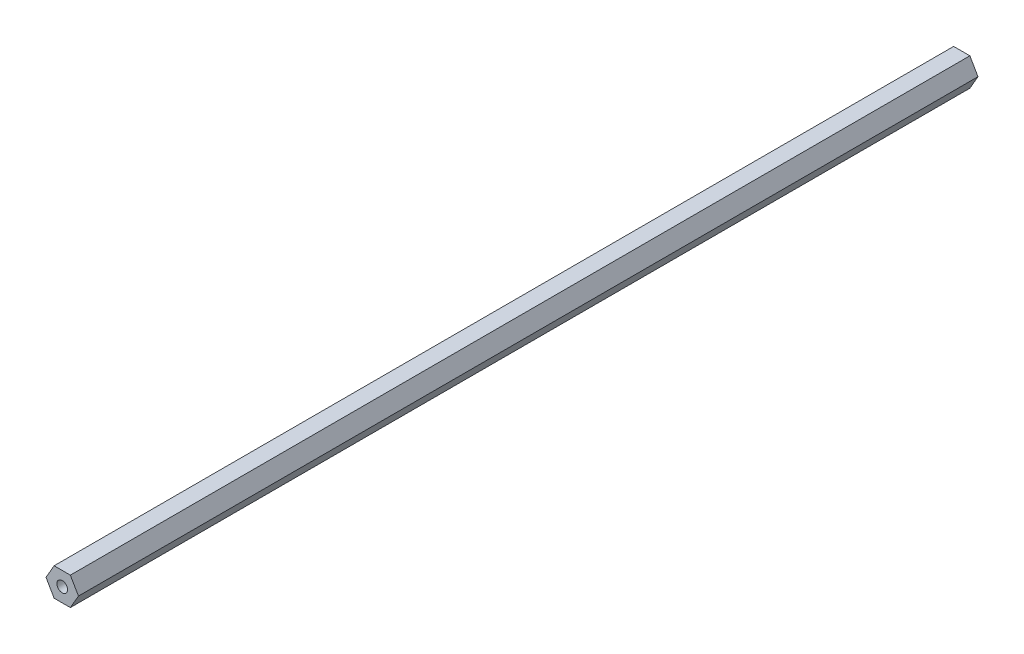
ISO-10303-21;
HEADER;
FILE_DESCRIPTION(('STEP AP214'),'2;1');
FILE_NAME('part.step','',(''),(''),'','','');
FILE_SCHEMA(('AUTOMOTIVE_DESIGN { 1 0 10303 214 1 1 1 1 }'));
ENDSEC;
DATA;
#1=APPLICATION_CONTEXT('core data for automotive mechanical design processes');
#2=APPLICATION_PROTOCOL_DEFINITION('international standard','automotive_design',2000,#1);
#3=PRODUCT_CONTEXT('',#1,'mechanical');
#4=PRODUCT('Part','Part','',(#3));
#5=PRODUCT_RELATED_PRODUCT_CATEGORY('part','',(#4));
#6=PRODUCT_DEFINITION_FORMATION('','',#4);
#7=PRODUCT_DEFINITION_CONTEXT('part definition',#1,'design');
#8=PRODUCT_DEFINITION('design','',#6,#7);
#9=PRODUCT_DEFINITION_SHAPE('','',#8);
#10=(LENGTH_UNIT() NAMED_UNIT(*) SI_UNIT(.MILLI.,.METRE.));
#11=(NAMED_UNIT(*) PLANE_ANGLE_UNIT() SI_UNIT($,.RADIAN.));
#12=(NAMED_UNIT(*) SI_UNIT($,.STERADIAN.) SOLID_ANGLE_UNIT());
#13=UNCERTAINTY_MEASURE_WITH_UNIT(LENGTH_MEASURE(1.E-05),#10,'distance_accuracy_value','');
#14=(GEOMETRIC_REPRESENTATION_CONTEXT(3) GLOBAL_UNCERTAINTY_ASSIGNED_CONTEXT((#13)) GLOBAL_UNIT_ASSIGNED_CONTEXT((#10,
#11,#12)) REPRESENTATION_CONTEXT('',''));
#15=CARTESIAN_POINT('',(0.,0.,0.));
#16=DIRECTION('',(0.,0.,1.));
#17=DIRECTION('',(1.,0.,0.));
#18=AXIS2_PLACEMENT_3D('',#15,#16,#17);
#19=CARTESIAN_POINT('',(3.66617420935418,-6.34999999999993,406.4));
#20=DIRECTION('',(-0.866025403784441,0.499999999999995,0.));
#21=DIRECTION('',(-0.499999999999995,-0.866025403784441,0.));
#22=AXIS2_PLACEMENT_3D('',#19,#20,#21);
#23=PLANE('',#22);
#24=DIRECTION('',(0.499999999999995,0.866025403784441,0.));
#25=VECTOR('',#24,1.);
#26=CARTESIAN_POINT('',(3.66617420935418,-6.34999999999993,0.));
#27=LINE('',#26,#25);
#28=CARTESIAN_POINT('',(3.66617420935418,-6.34999999999993,0.));
#29=VERTEX_POINT('',#28);
#30=CARTESIAN_POINT('',(7.33234841870821,0.,0.));
#31=VERTEX_POINT('',#30);
#32=EDGE_CURVE('E133',#29,#31,#27,.T.);
#33=ORIENTED_EDGE('',*,*,#32,.T.);
#34=DIRECTION('',(0.,0.,-1.));
#35=VECTOR('',#34,1.);
#36=CARTESIAN_POINT('',(7.33234841870821,0.,406.4));
#37=LINE('',#36,#35);
#38=CARTESIAN_POINT('',(7.33234841870821,0.,406.4));
#39=VERTEX_POINT('',#38);
#40=EDGE_CURVE('E11',#39,#31,#37,.T.);
#41=ORIENTED_EDGE('',*,*,#40,.F.);
#42=DIRECTION('',(0.499999999999995,0.866025403784441,0.));
#43=VECTOR('',#42,1.);
#44=CARTESIAN_POINT('',(3.66617420935418,-6.34999999999993,406.4));
#45=LINE('',#44,#43);
#46=CARTESIAN_POINT('',(3.66617420935418,-6.34999999999993,406.4));
#47=VERTEX_POINT('',#46);
#48=EDGE_CURVE('E150',#47,#39,#45,.T.);
#49=ORIENTED_EDGE('',*,*,#48,.F.);
#50=DIRECTION('',(0.,0.,-1.));
#51=VECTOR('',#50,1.);
#52=CARTESIAN_POINT('',(3.66617420935418,-6.34999999999993,406.4));
#53=LINE('',#52,#51);
#54=EDGE_CURVE('E129',#47,#29,#53,.T.);
#55=ORIENTED_EDGE('',*,*,#54,.T.);
#56=EDGE_LOOP('',(#33,#41,#49,#55));
#57=FACE_BOUND('',#56,.T.);
#58=ADVANCED_FACE('F44',(#57),#23,.F.);
#59=CARTESIAN_POINT('',(7.33234841870821,0.,406.4));
#60=DIRECTION('',(-0.866025403784438,-0.500000000000001,0.));
#61=DIRECTION('',(0.500000000000001,-0.866025403784438,0.));
#62=AXIS2_PLACEMENT_3D('',#59,#60,#61);
#63=PLANE('',#62);
#64=DIRECTION('',(-0.500000000000001,0.866025403784438,0.));
#65=VECTOR('',#64,1.);
#66=CARTESIAN_POINT('',(7.33234841870821,0.,0.));
#67=LINE('',#66,#65);
#68=CARTESIAN_POINT('',(3.66617420935409,6.34999999999998,0.));
#69=VERTEX_POINT('',#68);
#70=EDGE_CURVE('E137',#31,#69,#67,.T.);
#71=ORIENTED_EDGE('',*,*,#70,.T.);
#72=DIRECTION('',(0.,0.,-1.));
#73=VECTOR('',#72,1.);
#74=CARTESIAN_POINT('',(3.66617420935409,6.34999999999998,406.4));
#75=LINE('',#74,#73);
#76=CARTESIAN_POINT('',(3.66617420935409,6.34999999999998,406.4));
#77=VERTEX_POINT('',#76);
#78=EDGE_CURVE('E53',#77,#69,#75,.T.);
#79=ORIENTED_EDGE('',*,*,#78,.F.);
#80=DIRECTION('',(-0.500000000000001,0.866025403784438,0.));
#81=VECTOR('',#80,1.);
#82=CARTESIAN_POINT('',(7.33234841870821,0.,406.4));
#83=LINE('',#82,#81);
#84=EDGE_CURVE('E98',#39,#77,#83,.T.);
#85=ORIENTED_EDGE('',*,*,#84,.F.);
#86=ORIENTED_EDGE('',*,*,#40,.T.);
#87=EDGE_LOOP('',(#71,#79,#85,#86));
#88=FACE_BOUND('',#87,.T.);
#89=ADVANCED_FACE('F179',(#88),#63,.F.);
#90=CARTESIAN_POINT('',(3.66617420935409,6.34999999999998,406.4));
#91=DIRECTION('',(0.,-1.,0.));
#92=DIRECTION('',(1.,0.,0.));
#93=AXIS2_PLACEMENT_3D('',#90,#91,#92);
#94=PLANE('',#93);
#95=DIRECTION('',(-1.,0.,0.));
#96=VECTOR('',#95,1.);
#97=CARTESIAN_POINT('',(3.66617420935409,6.34999999999998,0.));
#98=LINE('',#97,#96);
#99=CARTESIAN_POINT('',(-3.66617420935413,6.34999999999995,0.));
#100=VERTEX_POINT('',#99);
#101=EDGE_CURVE('E141',#69,#100,#98,.T.);
#102=ORIENTED_EDGE('',*,*,#101,.T.);
#103=DIRECTION('',(0.,0.,-1.));
#104=VECTOR('',#103,1.);
#105=CARTESIAN_POINT('',(-3.66617420935413,6.34999999999995,406.4));
#106=LINE('',#105,#104);
#107=CARTESIAN_POINT('',(-3.66617420935413,6.34999999999995,406.4));
#108=VERTEX_POINT('',#107);
#109=EDGE_CURVE('E122',#108,#100,#106,.T.);
#110=ORIENTED_EDGE('',*,*,#109,.F.);
#111=DIRECTION('',(-1.,0.,0.));
#112=VECTOR('',#111,1.);
#113=CARTESIAN_POINT('',(3.66617420935409,6.34999999999998,406.4));
#114=LINE('',#113,#112);
#115=EDGE_CURVE('E111',#77,#108,#114,.T.);
#116=ORIENTED_EDGE('',*,*,#115,.F.);
#117=ORIENTED_EDGE('',*,*,#78,.T.);
#118=EDGE_LOOP('',(#102,#110,#116,#117));
#119=FACE_BOUND('',#118,.T.);
#120=ADVANCED_FACE('F160',(#119),#94,.F.);
#121=CARTESIAN_POINT('',(-3.66617420935413,6.34999999999995,406.4));
#122=DIRECTION('',(0.866025403784442,-0.499999999999995,0.));
#123=DIRECTION('',(0.499999999999995,0.866025403784442,0.));
#124=AXIS2_PLACEMENT_3D('',#121,#122,#123);
#125=PLANE('',#124);
#126=DIRECTION('',(-0.499999999999995,-0.866025403784442,0.));
#127=VECTOR('',#126,1.);
#128=CARTESIAN_POINT('',(-3.66617420935413,6.34999999999995,0.));
#129=LINE('',#128,#127);
#130=CARTESIAN_POINT('',(-7.33234841870821,0.,0.));
#131=VERTEX_POINT('',#130);
#132=EDGE_CURVE('E120',#100,#131,#129,.T.);
#133=ORIENTED_EDGE('',*,*,#132,.T.);
#134=DIRECTION('',(0.,0.,-1.));
#135=VECTOR('',#134,1.);
#136=CARTESIAN_POINT('',(-7.33234841870821,0.,406.4));
#137=LINE('',#136,#135);
#138=CARTESIAN_POINT('',(-7.33234841870821,0.,406.4));
#139=VERTEX_POINT('',#138);
#140=EDGE_CURVE('E117',#139,#131,#137,.T.);
#141=ORIENTED_EDGE('',*,*,#140,.F.);
#142=DIRECTION('',(-0.499999999999995,-0.866025403784442,0.));
#143=VECTOR('',#142,1.);
#144=CARTESIAN_POINT('',(-3.66617420935413,6.34999999999995,406.4));
#145=LINE('',#144,#143);
#146=EDGE_CURVE('E105',#108,#139,#145,.T.);
#147=ORIENTED_EDGE('',*,*,#146,.F.);
#148=ORIENTED_EDGE('',*,*,#109,.T.);
#149=EDGE_LOOP('',(#133,#141,#147,#148));
#150=FACE_BOUND('',#149,.T.);
#151=ADVANCED_FACE('F118',(#150),#125,.F.);
#152=CARTESIAN_POINT('',(-7.33234841870821,0.,406.4));
#153=DIRECTION('',(0.866025403784435,0.500000000000007,0.));
#154=DIRECTION('',(-0.500000000000007,0.866025403784435,0.));
#155=AXIS2_PLACEMENT_3D('',#152,#153,#154);
#156=PLANE('',#155);
#157=DIRECTION('',(0.500000000000007,-0.866025403784435,0.));
#158=VECTOR('',#157,1.);
#159=CARTESIAN_POINT('',(-7.33234841870821,0.,0.));
#160=LINE('',#159,#158);
#161=CARTESIAN_POINT('',(-3.66617420935405,-6.35,0.));
#162=VERTEX_POINT('',#161);
#163=EDGE_CURVE('E84',#131,#162,#160,.T.);
#164=ORIENTED_EDGE('',*,*,#163,.T.);
#165=DIRECTION('',(0.,0.,-1.));
#166=VECTOR('',#165,1.);
#167=CARTESIAN_POINT('',(-3.66617420935405,-6.35,406.4));
#168=LINE('',#167,#166);
#169=CARTESIAN_POINT('',(-3.66617420935405,-6.35,406.4));
#170=VERTEX_POINT('',#169);
#171=EDGE_CURVE('E123',#170,#162,#168,.T.);
#172=ORIENTED_EDGE('',*,*,#171,.F.);
#173=DIRECTION('',(0.500000000000007,-0.866025403784435,0.));
#174=VECTOR('',#173,1.);
#175=CARTESIAN_POINT('',(-7.33234841870821,0.,406.4));
#176=LINE('',#175,#174);
#177=EDGE_CURVE('E109',#139,#170,#176,.T.);
#178=ORIENTED_EDGE('',*,*,#177,.F.);
#179=ORIENTED_EDGE('',*,*,#140,.T.);
#180=EDGE_LOOP('',(#164,#172,#178,#179));
#181=FACE_BOUND('',#180,.T.);
#182=ADVANCED_FACE('F125',(#181),#156,.F.);
#183=CARTESIAN_POINT('',(-3.66617420935405,-6.35,406.4));
#184=DIRECTION('',(0.,1.,0.));
#185=DIRECTION('',(-1.,0.,0.));
#186=AXIS2_PLACEMENT_3D('',#183,#184,#185);
#187=PLANE('',#186);
#188=DIRECTION('',(1.,0.,0.));
#189=VECTOR('',#188,1.);
#190=CARTESIAN_POINT('',(-3.66617420935405,-6.35,0.));
#191=LINE('',#190,#189);
#192=EDGE_CURVE('E90',#162,#29,#191,.T.);
#193=ORIENTED_EDGE('',*,*,#192,.T.);
#194=ORIENTED_EDGE('',*,*,#54,.F.);
#195=DIRECTION('',(1.,0.,0.));
#196=VECTOR('',#195,1.);
#197=CARTESIAN_POINT('',(-3.66617420935405,-6.35,406.4));
#198=LINE('',#197,#196);
#199=EDGE_CURVE('E61',#170,#47,#198,.T.);
#200=ORIENTED_EDGE('',*,*,#199,.F.);
#201=ORIENTED_EDGE('',*,*,#171,.T.);
#202=EDGE_LOOP('',(#193,#194,#200,#201));
#203=FACE_BOUND('',#202,.T.);
#204=ADVANCED_FACE('F167',(#203),#187,.F.);
#205=CARTESIAN_POINT('',(0.,0.,406.4));
#206=DIRECTION('',(0.,0.,1.));
#207=DIRECTION('',(1.,0.,0.));
#208=AXIS2_PLACEMENT_3D('',#205,#206,#207);
#209=PLANE('',#208);
#210=CARTESIAN_POINT('',(0.,0.,406.4));
#211=DIRECTION('',(0.,0.,1.));
#212=DIRECTION('',(1.,0.,0.));
#213=AXIS2_PLACEMENT_3D('',#210,#211,#212);
#214=CIRCLE('',#213,2.413);
#215=CARTESIAN_POINT('',(2.413,0.,406.4));
#216=VERTEX_POINT('',#215);
#217=EDGE_CURVE('E138',#216,#216,#214,.T.);
#218=ORIENTED_EDGE('',*,*,#217,.F.);
#219=EDGE_LOOP('',(#218));
#220=FACE_BOUND('',#219,.T.);
#221=ORIENTED_EDGE('',*,*,#48,.T.);
#222=ORIENTED_EDGE('',*,*,#84,.T.);
#223=ORIENTED_EDGE('',*,*,#115,.T.);
#224=ORIENTED_EDGE('',*,*,#146,.T.);
#225=ORIENTED_EDGE('',*,*,#177,.T.);
#226=ORIENTED_EDGE('',*,*,#199,.T.);
#227=EDGE_LOOP('',(#221,#222,#223,#224,#225,#226));
#228=FACE_BOUND('',#227,.T.);
#229=ADVANCED_FACE('F107',(#220,#228),#209,.T.);
#230=CARTESIAN_POINT('',(0.,0.,0.));
#231=DIRECTION('',(0.,0.,1.));
#232=DIRECTION('',(1.,0.,0.));
#233=AXIS2_PLACEMENT_3D('',#230,#231,#232);
#234=PLANE('',#233);
#235=CARTESIAN_POINT('',(0.,0.,0.));
#236=DIRECTION('',(0.,0.,1.));
#237=DIRECTION('',(1.,0.,0.));
#238=AXIS2_PLACEMENT_3D('',#235,#236,#237);
#239=CIRCLE('',#238,2.413);
#240=CARTESIAN_POINT('',(2.413,0.,0.));
#241=VERTEX_POINT('',#240);
#242=EDGE_CURVE('E235',#241,#241,#239,.T.);
#243=ORIENTED_EDGE('',*,*,#242,.T.);
#244=EDGE_LOOP('',(#243));
#245=FACE_BOUND('',#244,.T.);
#246=ORIENTED_EDGE('',*,*,#32,.F.);
#247=ORIENTED_EDGE('',*,*,#192,.F.);
#248=ORIENTED_EDGE('',*,*,#163,.F.);
#249=ORIENTED_EDGE('',*,*,#132,.F.);
#250=ORIENTED_EDGE('',*,*,#101,.F.);
#251=ORIENTED_EDGE('',*,*,#70,.F.);
#252=EDGE_LOOP('',(#246,#247,#248,#249,#250,#251));
#253=FACE_BOUND('',#252,.T.);
#254=ADVANCED_FACE('F163',(#245,#253),#234,.F.);
#255=CARTESIAN_POINT('',(0.,0.,0.));
#256=DIRECTION('',(0.,0.,1.));
#257=DIRECTION('',(1.,0.,0.));
#258=AXIS2_PLACEMENT_3D('',#255,#256,#257);
#259=CYLINDRICAL_SURFACE('',#258,2.413);
#260=ORIENTED_EDGE('',*,*,#217,.T.);
#261=EDGE_LOOP('',(#260));
#262=FACE_BOUND('',#261,.T.);
#263=ORIENTED_EDGE('',*,*,#242,.F.);
#264=EDGE_LOOP('',(#263));
#265=FACE_BOUND('',#264,.T.);
#266=ADVANCED_FACE('F218',(#262,#265),#259,.F.);
#267=CLOSED_SHELL('',(#58,#89,#120,#151,#182,#204,#229,#254,#266));
#268=MANIFOLD_SOLID_BREP('B2',#267);
#269=ADVANCED_BREP_SHAPE_REPRESENTATION('',(#18,#268),#14);
#270=SHAPE_DEFINITION_REPRESENTATION(#9,#269);
ENDSEC;
END-ISO-10303-21;
